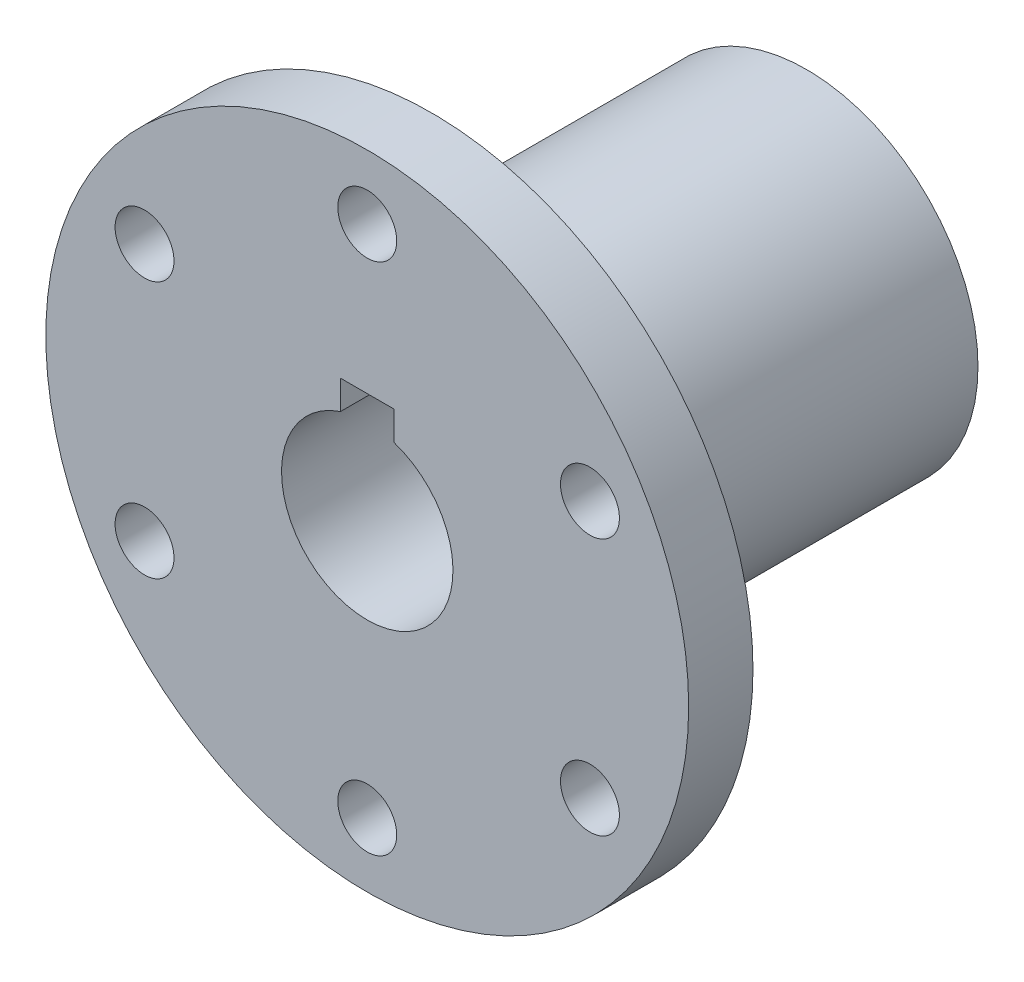
ISO-10303-21;
HEADER;
FILE_DESCRIPTION(('STEP AP214'),'2;1');
FILE_NAME('part.step','',(''),(''),'','','');
FILE_SCHEMA(('AUTOMOTIVE_DESIGN { 1 0 10303 214 1 1 1 1 }'));
ENDSEC;
DATA;
#1=APPLICATION_CONTEXT('core data for automotive mechanical design processes');
#2=APPLICATION_PROTOCOL_DEFINITION('international standard','automotive_design',2000,#1);
#3=PRODUCT_CONTEXT('',#1,'mechanical');
#4=PRODUCT('Part','Part','',(#3));
#5=PRODUCT_RELATED_PRODUCT_CATEGORY('part','',(#4));
#6=PRODUCT_DEFINITION_FORMATION('','',#4);
#7=PRODUCT_DEFINITION_CONTEXT('part definition',#1,'design');
#8=PRODUCT_DEFINITION('design','',#6,#7);
#9=PRODUCT_DEFINITION_SHAPE('','',#8);
#10=(LENGTH_UNIT() NAMED_UNIT(*) SI_UNIT(.MILLI.,.METRE.));
#11=(NAMED_UNIT(*) PLANE_ANGLE_UNIT() SI_UNIT($,.RADIAN.));
#12=(NAMED_UNIT(*) SI_UNIT($,.STERADIAN.) SOLID_ANGLE_UNIT());
#13=UNCERTAINTY_MEASURE_WITH_UNIT(LENGTH_MEASURE(1.E-05),#10,'distance_accuracy_value','');
#14=(GEOMETRIC_REPRESENTATION_CONTEXT(3) GLOBAL_UNCERTAINTY_ASSIGNED_CONTEXT((#13)) GLOBAL_UNIT_ASSIGNED_CONTEXT((#10,
#11,#12)) REPRESENTATION_CONTEXT('',''));
#15=CARTESIAN_POINT('',(0.,0.,0.));
#16=DIRECTION('',(0.,0.,1.));
#17=DIRECTION('',(1.,0.,0.));
#18=AXIS2_PLACEMENT_3D('',#15,#16,#17);
#19=CARTESIAN_POINT('',(0.,0.,0.));
#20=DIRECTION('',(0.,0.,-1.));
#21=DIRECTION('',(-1.,0.,0.));
#22=AXIS2_PLACEMENT_3D('',#19,#20,#21);
#23=PLANE('',#22);
#24=DIRECTION('',(1.,0.,0.));
#25=VECTOR('',#24,1.);
#26=CARTESIAN_POINT('',(2.5,10.3,0.));
#27=LINE('',#26,#25);
#28=CARTESIAN_POINT('',(-2.5,10.3,0.));
#29=VERTEX_POINT('',#28);
#30=CARTESIAN_POINT('',(2.5,10.3,0.));
#31=VERTEX_POINT('',#30);
#32=EDGE_CURVE('E87',#29,#31,#27,.T.);
#33=ORIENTED_EDGE('',*,*,#32,.T.);
#34=DIRECTION('',(0.,-1.,0.));
#35=VECTOR('',#34,1.);
#36=CARTESIAN_POINT('',(2.5,7.59934207678533,0.));
#37=LINE('',#36,#35);
#38=CARTESIAN_POINT('',(2.5,7.59934207678533,0.));
#39=VERTEX_POINT('',#38);
#40=EDGE_CURVE('E90',#31,#39,#37,.T.);
#41=ORIENTED_EDGE('',*,*,#40,.T.);
#42=CARTESIAN_POINT('',(0.,0.,0.));
#43=DIRECTION('',(0.,0.,-1.));
#44=DIRECTION('',(-1.,0.,0.));
#45=AXIS2_PLACEMENT_3D('',#42,#43,#44);
#46=CIRCLE('',#45,8.);
#47=CARTESIAN_POINT('',(-2.5,7.59934207678533,0.));
#48=VERTEX_POINT('',#47);
#49=EDGE_CURVE('E95',#39,#48,#46,.T.);
#50=ORIENTED_EDGE('',*,*,#49,.T.);
#51=DIRECTION('',(0.,1.,0.));
#52=VECTOR('',#51,1.);
#53=CARTESIAN_POINT('',(-2.5,10.3,0.));
#54=LINE('',#53,#52);
#55=EDGE_CURVE('E48',#48,#29,#54,.T.);
#56=ORIENTED_EDGE('',*,*,#55,.T.);
#57=EDGE_LOOP('',(#33,#41,#50,#56));
#58=FACE_BOUND('',#57,.T.);
#59=CARTESIAN_POINT('',(0.,24.,0.));
#60=DIRECTION('',(0.,0.,-1.));
#61=DIRECTION('',(-1.,0.,0.));
#62=AXIS2_PLACEMENT_3D('',#59,#60,#61);
#63=CIRCLE('',#62,2.75);
#64=CARTESIAN_POINT('',(-2.75,24.,0.));
#65=VERTEX_POINT('',#64);
#66=EDGE_CURVE('E114',#65,#65,#63,.F.);
#67=ORIENTED_EDGE('',*,*,#66,.F.);
#68=EDGE_LOOP('',(#67));
#69=FACE_BOUND('',#68,.T.);
#70=CARTESIAN_POINT('',(20.784609690826,11.9999999999991,0.));
#71=DIRECTION('',(0.,0.,-1.));
#72=DIRECTION('',(-1.,0.,0.));
#73=AXIS2_PLACEMENT_3D('',#70,#71,#72);
#74=CIRCLE('',#73,2.75000000000103);
#75=CARTESIAN_POINT('',(18.034609690825,11.9999999999991,0.));
#76=VERTEX_POINT('',#75);
#77=EDGE_CURVE('E121',#76,#76,#74,.F.);
#78=ORIENTED_EDGE('',*,*,#77,.F.);
#79=EDGE_LOOP('',(#78));
#80=FACE_BOUND('',#79,.T.);
#81=CARTESIAN_POINT('',(20.784609690825,-12.0000000000009,0.));
#82=DIRECTION('',(0.,0.,-1.));
#83=DIRECTION('',(-1.,0.,0.));
#84=AXIS2_PLACEMENT_3D('',#81,#82,#83);
#85=CIRCLE('',#84,2.75000000000194);
#86=CARTESIAN_POINT('',(18.0346096908231,-12.0000000000009,0.));
#87=VERTEX_POINT('',#86);
#88=EDGE_CURVE('E140',#87,#87,#85,.F.);
#89=ORIENTED_EDGE('',*,*,#88,.F.);
#90=EDGE_LOOP('',(#89));
#91=FACE_BOUND('',#90,.T.);
#92=CARTESIAN_POINT('',(-2.04048477435318E-12,-24.,0.));
#93=DIRECTION('',(0.,0.,-1.));
#94=DIRECTION('',(-1.,0.,0.));
#95=AXIS2_PLACEMENT_3D('',#92,#93,#94);
#96=CIRCLE('',#95,2.75000000000211);
#97=CARTESIAN_POINT('',(-2.75000000000415,-24.,0.));
#98=VERTEX_POINT('',#97);
#99=EDGE_CURVE('E134',#98,#98,#96,.F.);
#100=ORIENTED_EDGE('',*,*,#99,.F.);
#101=EDGE_LOOP('',(#100));
#102=FACE_BOUND('',#101,.T.);
#103=CARTESIAN_POINT('',(-20.7846096908281,-11.9999999999991,0.));
#104=DIRECTION('',(0.,0.,-1.));
#105=DIRECTION('',(-1.,0.,0.));
#106=AXIS2_PLACEMENT_3D('',#103,#104,#105);
#107=CIRCLE('',#106,2.75000000000131);
#108=CARTESIAN_POINT('',(-23.5346096908294,-11.9999999999991,0.));
#109=VERTEX_POINT('',#108);
#110=EDGE_CURVE('E128',#109,#109,#107,.F.);
#111=ORIENTED_EDGE('',*,*,#110,.F.);
#112=EDGE_LOOP('',(#111));
#113=FACE_BOUND('',#112,.T.);
#114=CARTESIAN_POINT('',(-20.784609690827,12.0000000000009,0.));
#115=DIRECTION('',(0.,0.,-1.));
#116=DIRECTION('',(-1.,0.,0.));
#117=AXIS2_PLACEMENT_3D('',#114,#115,#116);
#118=CIRCLE('',#117,2.75000000000029);
#119=CARTESIAN_POINT('',(-23.5346096908273,12.0000000000009,0.));
#120=VERTEX_POINT('',#119);
#121=EDGE_CURVE('E115',#120,#120,#118,.F.);
#122=ORIENTED_EDGE('',*,*,#121,.F.);
#123=EDGE_LOOP('',(#122));
#124=FACE_BOUND('',#123,.T.);
#125=CARTESIAN_POINT('',(0.,0.,0.));
#126=DIRECTION('',(0.,0.,1.));
#127=DIRECTION('',(1.,0.,0.));
#128=AXIS2_PLACEMENT_3D('',#125,#126,#127);
#129=CIRCLE('',#128,30.);
#130=CARTESIAN_POINT('',(30.,0.,0.));
#131=VERTEX_POINT('',#130);
#132=EDGE_CURVE('E152',#131,#131,#129,.T.);
#133=ORIENTED_EDGE('',*,*,#132,.T.);
#134=EDGE_LOOP('',(#133));
#135=FACE_BOUND('',#134,.T.);
#136=ADVANCED_FACE('F33',(#58,#69,#80,#91,#102,#113,#124,#135),#23,.F.);
#137=CARTESIAN_POINT('',(0.,0.,0.));
#138=DIRECTION('',(0.,0.,1.));
#139=DIRECTION('',(1.,0.,0.));
#140=AXIS2_PLACEMENT_3D('',#137,#138,#139);
#141=CYLINDRICAL_SURFACE('',#140,30.);
#142=ORIENTED_EDGE('',*,*,#132,.F.);
#143=EDGE_LOOP('',(#142));
#144=FACE_BOUND('',#143,.T.);
#145=CARTESIAN_POINT('',(0.,0.,-6.));
#146=DIRECTION('',(0.,0.,1.));
#147=DIRECTION('',(1.,0.,0.));
#148=AXIS2_PLACEMENT_3D('',#145,#146,#147);
#149=CIRCLE('',#148,30.);
#150=CARTESIAN_POINT('',(30.,0.,-6.));
#151=VERTEX_POINT('',#150);
#152=EDGE_CURVE('E149',#151,#151,#149,.T.);
#153=ORIENTED_EDGE('',*,*,#152,.T.);
#154=EDGE_LOOP('',(#153));
#155=FACE_BOUND('',#154,.T.);
#156=ADVANCED_FACE('F177',(#144,#155),#141,.T.);
#157=CARTESIAN_POINT('',(0.,30.,-6.));
#158=DIRECTION('',(0.,0.,1.));
#159=DIRECTION('',(1.,0.,0.));
#160=AXIS2_PLACEMENT_3D('',#157,#158,#159);
#161=PLANE('',#160);
#162=CARTESIAN_POINT('',(0.,0.,-6.));
#163=DIRECTION('',(0.,0.,1.));
#164=DIRECTION('',(1.,0.,0.));
#165=AXIS2_PLACEMENT_3D('',#162,#163,#164);
#166=CIRCLE('',#165,18.);
#167=CARTESIAN_POINT('',(18.,0.,-6.));
#168=VERTEX_POINT('',#167);
#169=EDGE_CURVE('E41',#168,#168,#166,.T.);
#170=ORIENTED_EDGE('',*,*,#169,.T.);
#171=EDGE_LOOP('',(#170));
#172=FACE_BOUND('',#171,.T.);
#173=CARTESIAN_POINT('',(0.,24.,-6.));
#174=DIRECTION('',(0.,0.,-1.));
#175=DIRECTION('',(-1.,0.,0.));
#176=AXIS2_PLACEMENT_3D('',#173,#174,#175);
#177=CIRCLE('',#176,2.75);
#178=CARTESIAN_POINT('',(-2.75,24.,-6.));
#179=VERTEX_POINT('',#178);
#180=EDGE_CURVE('E111',#179,#179,#177,.T.);
#181=ORIENTED_EDGE('',*,*,#180,.F.);
#182=EDGE_LOOP('',(#181));
#183=FACE_BOUND('',#182,.T.);
#184=CARTESIAN_POINT('',(20.784609690826,11.9999999999991,-6.));
#185=DIRECTION('',(0.,0.,-1.));
#186=DIRECTION('',(-1.,0.,0.));
#187=AXIS2_PLACEMENT_3D('',#184,#185,#186);
#188=CIRCLE('',#187,2.75000000000103);
#189=CARTESIAN_POINT('',(18.034609690825,11.9999999999991,-6.));
#190=VERTEX_POINT('',#189);
#191=EDGE_CURVE('E108',#190,#190,#188,.T.);
#192=ORIENTED_EDGE('',*,*,#191,.F.);
#193=EDGE_LOOP('',(#192));
#194=FACE_BOUND('',#193,.T.);
#195=CARTESIAN_POINT('',(20.784609690825,-12.0000000000009,-6.));
#196=DIRECTION('',(0.,0.,-1.));
#197=DIRECTION('',(-1.,0.,0.));
#198=AXIS2_PLACEMENT_3D('',#195,#196,#197);
#199=CIRCLE('',#198,2.75000000000194);
#200=CARTESIAN_POINT('',(18.0346096908231,-12.0000000000009,-6.));
#201=VERTEX_POINT('',#200);
#202=EDGE_CURVE('E124',#201,#201,#199,.T.);
#203=ORIENTED_EDGE('',*,*,#202,.F.);
#204=EDGE_LOOP('',(#203));
#205=FACE_BOUND('',#204,.T.);
#206=CARTESIAN_POINT('',(-2.04048477435318E-12,-24.,-6.));
#207=DIRECTION('',(0.,0.,-1.));
#208=DIRECTION('',(-1.,0.,0.));
#209=AXIS2_PLACEMENT_3D('',#206,#207,#208);
#210=CIRCLE('',#209,2.75000000000211);
#211=CARTESIAN_POINT('',(-2.75000000000415,-24.,-6.));
#212=VERTEX_POINT('',#211);
#213=EDGE_CURVE('E137',#212,#212,#210,.T.);
#214=ORIENTED_EDGE('',*,*,#213,.F.);
#215=EDGE_LOOP('',(#214));
#216=FACE_BOUND('',#215,.T.);
#217=CARTESIAN_POINT('',(-20.7846096908281,-11.9999999999991,-6.));
#218=DIRECTION('',(0.,0.,-1.));
#219=DIRECTION('',(-1.,0.,0.));
#220=AXIS2_PLACEMENT_3D('',#217,#218,#219);
#221=CIRCLE('',#220,2.75000000000131);
#222=CARTESIAN_POINT('',(-23.5346096908294,-11.9999999999991,-6.));
#223=VERTEX_POINT('',#222);
#224=EDGE_CURVE('E131',#223,#223,#221,.T.);
#225=ORIENTED_EDGE('',*,*,#224,.F.);
#226=EDGE_LOOP('',(#225));
#227=FACE_BOUND('',#226,.T.);
#228=CARTESIAN_POINT('',(-20.784609690827,12.0000000000009,-6.));
#229=DIRECTION('',(0.,0.,-1.));
#230=DIRECTION('',(-1.,0.,0.));
#231=AXIS2_PLACEMENT_3D('',#228,#229,#230);
#232=CIRCLE('',#231,2.75000000000029);
#233=CARTESIAN_POINT('',(-23.5346096908273,12.0000000000009,-6.));
#234=VERTEX_POINT('',#233);
#235=EDGE_CURVE('E125',#234,#234,#232,.T.);
#236=ORIENTED_EDGE('',*,*,#235,.F.);
#237=EDGE_LOOP('',(#236));
#238=FACE_BOUND('',#237,.T.);
#239=ORIENTED_EDGE('',*,*,#152,.F.);
#240=EDGE_LOOP('',(#239));
#241=FACE_BOUND('',#240,.T.);
#242=ADVANCED_FACE('F157',(#172,#183,#194,#205,#216,#227,#238,#241),#161,.F.);
#243=CARTESIAN_POINT('',(0.,0.,0.));
#244=DIRECTION('',(0.,0.,1.));
#245=DIRECTION('',(1.,0.,0.));
#246=AXIS2_PLACEMENT_3D('',#243,#244,#245);
#247=CYLINDRICAL_SURFACE('',#246,16.);
#248=CARTESIAN_POINT('',(0.,0.,-8.));
#249=DIRECTION('',(0.,0.,1.));
#250=DIRECTION('',(1.,0.,0.));
#251=AXIS2_PLACEMENT_3D('',#248,#249,#250);
#252=CIRCLE('',#251,16.);
#253=CARTESIAN_POINT('',(16.,0.,-8.));
#254=VERTEX_POINT('',#253);
#255=EDGE_CURVE('E11',#254,#254,#252,.F.);
#256=ORIENTED_EDGE('',*,*,#255,.T.);
#257=EDGE_LOOP('',(#256));
#258=FACE_BOUND('',#257,.T.);
#259=CARTESIAN_POINT('',(0.,0.,-41.));
#260=DIRECTION('',(0.,0.,1.));
#261=DIRECTION('',(1.,0.,0.));
#262=AXIS2_PLACEMENT_3D('',#259,#260,#261);
#263=CIRCLE('',#262,16.);
#264=CARTESIAN_POINT('',(16.,0.,-41.));
#265=VERTEX_POINT('',#264);
#266=EDGE_CURVE('E118',#265,#265,#263,.T.);
#267=ORIENTED_EDGE('',*,*,#266,.T.);
#268=EDGE_LOOP('',(#267));
#269=FACE_BOUND('',#268,.T.);
#270=ADVANCED_FACE('F187',(#258,#269),#247,.T.);
#271=CARTESIAN_POINT('',(0.,16.,-41.));
#272=DIRECTION('',(0.,0.,1.));
#273=DIRECTION('',(1.,0.,0.));
#274=AXIS2_PLACEMENT_3D('',#271,#272,#273);
#275=PLANE('',#274);
#276=CARTESIAN_POINT('',(0.,0.,-41.));
#277=DIRECTION('',(0.,0.,-1.));
#278=DIRECTION('',(-1.,0.,0.));
#279=AXIS2_PLACEMENT_3D('',#276,#277,#278);
#280=CIRCLE('',#279,8.);
#281=CARTESIAN_POINT('',(2.5,7.59934207678533,-41.));
#282=VERTEX_POINT('',#281);
#283=CARTESIAN_POINT('',(-2.5,7.59934207678533,-41.));
#284=VERTEX_POINT('',#283);
#285=EDGE_CURVE('E104',#282,#284,#280,.T.);
#286=ORIENTED_EDGE('',*,*,#285,.F.);
#287=DIRECTION('',(0.,-1.,0.));
#288=VECTOR('',#287,1.);
#289=CARTESIAN_POINT('',(2.5,7.59934207678533,-41.));
#290=LINE('',#289,#288);
#291=CARTESIAN_POINT('',(2.5,10.3,-41.));
#292=VERTEX_POINT('',#291);
#293=EDGE_CURVE('E73',#292,#282,#290,.T.);
#294=ORIENTED_EDGE('',*,*,#293,.F.);
#295=DIRECTION('',(1.,0.,0.));
#296=VECTOR('',#295,1.);
#297=CARTESIAN_POINT('',(2.5,10.3,-41.));
#298=LINE('',#297,#296);
#299=CARTESIAN_POINT('',(-2.5,10.3,-41.));
#300=VERTEX_POINT('',#299);
#301=EDGE_CURVE('E97',#300,#292,#298,.T.);
#302=ORIENTED_EDGE('',*,*,#301,.F.);
#303=DIRECTION('',(0.,1.,0.));
#304=VECTOR('',#303,1.);
#305=CARTESIAN_POINT('',(-2.5,10.3,-41.));
#306=LINE('',#305,#304);
#307=EDGE_CURVE('E79',#284,#300,#306,.T.);
#308=ORIENTED_EDGE('',*,*,#307,.F.);
#309=EDGE_LOOP('',(#286,#294,#302,#308));
#310=FACE_BOUND('',#309,.T.);
#311=ORIENTED_EDGE('',*,*,#266,.F.);
#312=EDGE_LOOP('',(#311));
#313=FACE_BOUND('',#312,.T.);
#314=ADVANCED_FACE('F190',(#310,#313),#275,.F.);
#315=CARTESIAN_POINT('',(-20.784609690827,12.0000000000009,0.00100000000000013));
#316=DIRECTION('',(0.,0.,-1.));
#317=DIRECTION('',(-1.,0.,0.));
#318=AXIS2_PLACEMENT_3D('',#315,#316,#317);
#319=CYLINDRICAL_SURFACE('',#318,2.75000000000029);
#320=ORIENTED_EDGE('',*,*,#235,.T.);
#321=EDGE_LOOP('',(#320));
#322=FACE_BOUND('',#321,.T.);
#323=ORIENTED_EDGE('',*,*,#121,.T.);
#324=EDGE_LOOP('',(#323));
#325=FACE_BOUND('',#324,.T.);
#326=ADVANCED_FACE('F193',(#322,#325),#319,.F.);
#327=CARTESIAN_POINT('',(-20.7846096908281,-11.9999999999991,0.00100000000000013));
#328=DIRECTION('',(0.,0.,-1.));
#329=DIRECTION('',(-1.,0.,0.));
#330=AXIS2_PLACEMENT_3D('',#327,#328,#329);
#331=CYLINDRICAL_SURFACE('',#330,2.75000000000131);
#332=ORIENTED_EDGE('',*,*,#224,.T.);
#333=EDGE_LOOP('',(#332));
#334=FACE_BOUND('',#333,.T.);
#335=ORIENTED_EDGE('',*,*,#110,.T.);
#336=EDGE_LOOP('',(#335));
#337=FACE_BOUND('',#336,.T.);
#338=ADVANCED_FACE('F202',(#334,#337),#331,.F.);
#339=CARTESIAN_POINT('',(-2.04048477435318E-12,-24.,0.00100000000000013));
#340=DIRECTION('',(0.,0.,-1.));
#341=DIRECTION('',(-1.,0.,0.));
#342=AXIS2_PLACEMENT_3D('',#339,#340,#341);
#343=CYLINDRICAL_SURFACE('',#342,2.75000000000211);
#344=ORIENTED_EDGE('',*,*,#213,.T.);
#345=EDGE_LOOP('',(#344));
#346=FACE_BOUND('',#345,.T.);
#347=ORIENTED_EDGE('',*,*,#99,.T.);
#348=EDGE_LOOP('',(#347));
#349=FACE_BOUND('',#348,.T.);
#350=ADVANCED_FACE('F198',(#346,#349),#343,.F.);
#351=CARTESIAN_POINT('',(20.784609690825,-12.0000000000009,0.00100000000000013));
#352=DIRECTION('',(0.,0.,-1.));
#353=DIRECTION('',(-1.,0.,0.));
#354=AXIS2_PLACEMENT_3D('',#351,#352,#353);
#355=CYLINDRICAL_SURFACE('',#354,2.75000000000194);
#356=ORIENTED_EDGE('',*,*,#202,.T.);
#357=EDGE_LOOP('',(#356));
#358=FACE_BOUND('',#357,.T.);
#359=ORIENTED_EDGE('',*,*,#88,.T.);
#360=EDGE_LOOP('',(#359));
#361=FACE_BOUND('',#360,.T.);
#362=ADVANCED_FACE('F195',(#358,#361),#355,.F.);
#363=CARTESIAN_POINT('',(20.784609690826,11.9999999999991,0.00100000000000013));
#364=DIRECTION('',(0.,0.,-1.));
#365=DIRECTION('',(-1.,0.,0.));
#366=AXIS2_PLACEMENT_3D('',#363,#364,#365);
#367=CYLINDRICAL_SURFACE('',#366,2.75000000000103);
#368=ORIENTED_EDGE('',*,*,#191,.T.);
#369=EDGE_LOOP('',(#368));
#370=FACE_BOUND('',#369,.T.);
#371=ORIENTED_EDGE('',*,*,#77,.T.);
#372=EDGE_LOOP('',(#371));
#373=FACE_BOUND('',#372,.T.);
#374=ADVANCED_FACE('F172',(#370,#373),#367,.F.);
#375=CARTESIAN_POINT('',(0.,24.,0.00100000000000013));
#376=DIRECTION('',(0.,0.,-1.));
#377=DIRECTION('',(-1.,0.,0.));
#378=AXIS2_PLACEMENT_3D('',#375,#376,#377);
#379=CYLINDRICAL_SURFACE('',#378,2.75);
#380=ORIENTED_EDGE('',*,*,#180,.T.);
#381=EDGE_LOOP('',(#380));
#382=FACE_BOUND('',#381,.T.);
#383=ORIENTED_EDGE('',*,*,#66,.T.);
#384=EDGE_LOOP('',(#383));
#385=FACE_BOUND('',#384,.T.);
#386=ADVANCED_FACE('F162',(#382,#385),#379,.F.);
#387=CARTESIAN_POINT('',(0.,0.,-8.));
#388=DIRECTION('',(0.,0.,1.));
#389=DIRECTION('',(1.,0.,0.));
#390=AXIS2_PLACEMENT_3D('',#387,#388,#389);
#391=TOROIDAL_SURFACE('',#390,18.,2.);
#392=ORIENTED_EDGE('',*,*,#255,.F.);
#393=EDGE_LOOP('',(#392));
#394=FACE_BOUND('',#393,.T.);
#395=ORIENTED_EDGE('',*,*,#169,.F.);
#396=EDGE_LOOP('',(#395));
#397=FACE_BOUND('',#396,.T.);
#398=ADVANCED_FACE('F35',(#394,#397),#391,.F.);
#399=CARTESIAN_POINT('',(0.,0.,0.));
#400=DIRECTION('',(0.,0.,-1.));
#401=DIRECTION('',(-1.,0.,0.));
#402=AXIS2_PLACEMENT_3D('',#399,#400,#401);
#403=CYLINDRICAL_SURFACE('',#402,8.);
#404=ORIENTED_EDGE('',*,*,#49,.F.);
#405=DIRECTION('',(0.,0.,-1.));
#406=VECTOR('',#405,1.);
#407=CARTESIAN_POINT('',(2.5,7.59934207678533,0.));
#408=LINE('',#407,#406);
#409=EDGE_CURVE('E57',#39,#282,#408,.T.);
#410=ORIENTED_EDGE('',*,*,#409,.T.);
#411=ORIENTED_EDGE('',*,*,#285,.T.);
#412=DIRECTION('',(0.,0.,-1.));
#413=VECTOR('',#412,1.);
#414=CARTESIAN_POINT('',(-2.5,7.59934207678533,0.));
#415=LINE('',#414,#413);
#416=EDGE_CURVE('E84',#48,#284,#415,.T.);
#417=ORIENTED_EDGE('',*,*,#416,.F.);
#418=EDGE_LOOP('',(#404,#410,#411,#417));
#419=FACE_BOUND('',#418,.T.);
#420=ADVANCED_FACE('F161',(#419),#403,.F.);
#421=CARTESIAN_POINT('',(2.5,7.59934207678533,0.));
#422=DIRECTION('',(1.,0.,0.));
#423=DIRECTION('',(0.,0.,-1.));
#424=AXIS2_PLACEMENT_3D('',#421,#422,#423);
#425=PLANE('',#424);
#426=ORIENTED_EDGE('',*,*,#293,.T.);
#427=ORIENTED_EDGE('',*,*,#409,.F.);
#428=ORIENTED_EDGE('',*,*,#40,.F.);
#429=DIRECTION('',(0.,0.,-1.));
#430=VECTOR('',#429,1.);
#431=CARTESIAN_POINT('',(2.5,10.3,0.));
#432=LINE('',#431,#430);
#433=EDGE_CURVE('E83',#31,#292,#432,.T.);
#434=ORIENTED_EDGE('',*,*,#433,.T.);
#435=EDGE_LOOP('',(#426,#427,#428,#434));
#436=FACE_BOUND('',#435,.T.);
#437=ADVANCED_FACE('F169',(#436),#425,.F.);
#438=CARTESIAN_POINT('',(2.5,10.3,0.));
#439=DIRECTION('',(0.,1.,0.));
#440=DIRECTION('',(0.,0.,1.));
#441=AXIS2_PLACEMENT_3D('',#438,#439,#440);
#442=PLANE('',#441);
#443=ORIENTED_EDGE('',*,*,#301,.T.);
#444=ORIENTED_EDGE('',*,*,#433,.F.);
#445=ORIENTED_EDGE('',*,*,#32,.F.);
#446=DIRECTION('',(0.,0.,-1.));
#447=VECTOR('',#446,1.);
#448=CARTESIAN_POINT('',(-2.5,10.3,0.));
#449=LINE('',#448,#447);
#450=EDGE_CURVE('E75',#29,#300,#449,.T.);
#451=ORIENTED_EDGE('',*,*,#450,.T.);
#452=EDGE_LOOP('',(#443,#444,#445,#451));
#453=FACE_BOUND('',#452,.T.);
#454=ADVANCED_FACE('F88',(#453),#442,.F.);
#455=CARTESIAN_POINT('',(-2.5,10.3,0.));
#456=DIRECTION('',(-1.,0.,0.));
#457=DIRECTION('',(0.,-1.,0.));
#458=AXIS2_PLACEMENT_3D('',#455,#456,#457);
#459=PLANE('',#458);
#460=ORIENTED_EDGE('',*,*,#307,.T.);
#461=ORIENTED_EDGE('',*,*,#450,.F.);
#462=ORIENTED_EDGE('',*,*,#55,.F.);
#463=ORIENTED_EDGE('',*,*,#416,.T.);
#464=EDGE_LOOP('',(#460,#461,#462,#463));
#465=FACE_BOUND('',#464,.T.);
#466=ADVANCED_FACE('F77',(#465),#459,.F.);
#467=CLOSED_SHELL('',(#136,#156,#242,#270,#314,#326,#338,#350,#362,#374,#386,#398,#420,#437,
#454,#466));
#468=MANIFOLD_SOLID_BREP('B2',#467);
#469=ADVANCED_BREP_SHAPE_REPRESENTATION('',(#18,#468),#14);
#470=SHAPE_DEFINITION_REPRESENTATION(#9,#469);
ENDSEC;
END-ISO-10303-21;
